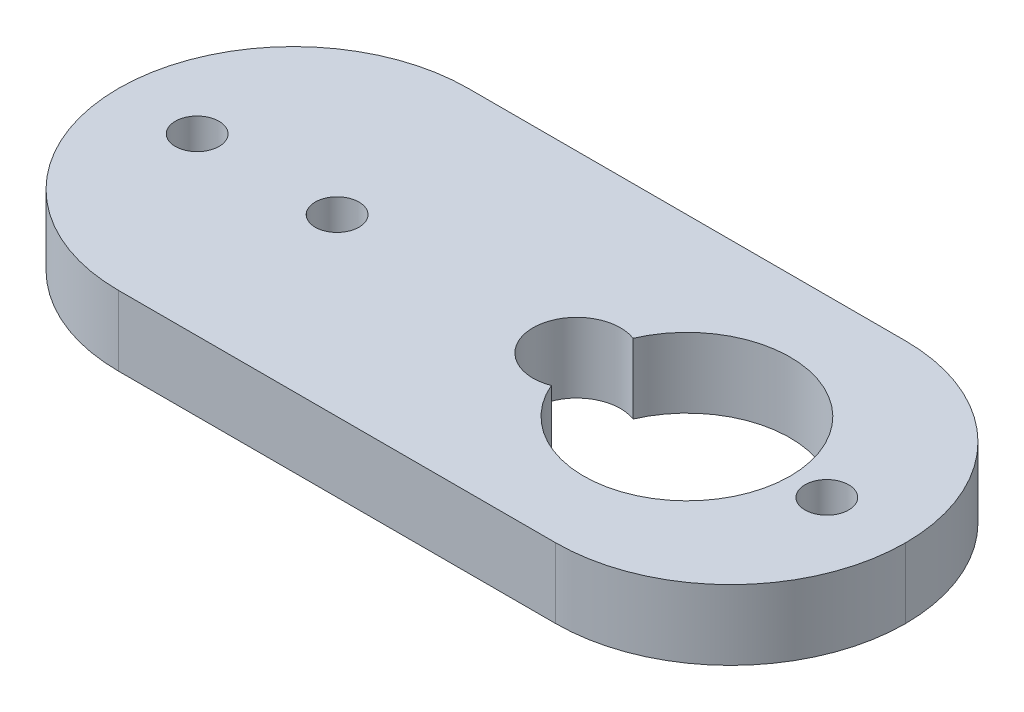
ISO-10303-21;
HEADER;
FILE_DESCRIPTION(('STEP AP214'),'2;1');
FILE_NAME('part.step','',(''),(''),'','','');
FILE_SCHEMA(('AUTOMOTIVE_DESIGN { 1 0 10303 214 1 1 1 1 }'));
ENDSEC;
DATA;
#1=APPLICATION_CONTEXT('core data for automotive mechanical design processes');
#2=APPLICATION_PROTOCOL_DEFINITION('international standard','automotive_design',2000,#1);
#3=PRODUCT_CONTEXT('',#1,'mechanical');
#4=PRODUCT('Part','Part','',(#3));
#5=PRODUCT_RELATED_PRODUCT_CATEGORY('part','',(#4));
#6=PRODUCT_DEFINITION_FORMATION('','',#4);
#7=PRODUCT_DEFINITION_CONTEXT('part definition',#1,'design');
#8=PRODUCT_DEFINITION('design','',#6,#7);
#9=PRODUCT_DEFINITION_SHAPE('','',#8);
#10=(LENGTH_UNIT() NAMED_UNIT(*) SI_UNIT(.MILLI.,.METRE.));
#11=(NAMED_UNIT(*) PLANE_ANGLE_UNIT() SI_UNIT($,.RADIAN.));
#12=(NAMED_UNIT(*) SI_UNIT($,.STERADIAN.) SOLID_ANGLE_UNIT());
#13=UNCERTAINTY_MEASURE_WITH_UNIT(LENGTH_MEASURE(1.E-05),#10,'distance_accuracy_value','');
#14=(GEOMETRIC_REPRESENTATION_CONTEXT(3) GLOBAL_UNCERTAINTY_ASSIGNED_CONTEXT((#13)) GLOBAL_UNIT_ASSIGNED_CONTEXT((#10,
#11,#12)) REPRESENTATION_CONTEXT('',''));
#15=CARTESIAN_POINT('',(0.,0.,0.));
#16=DIRECTION('',(0.,0.,1.));
#17=DIRECTION('',(1.,0.,0.));
#18=AXIS2_PLACEMENT_3D('',#15,#16,#17);
#19=CARTESIAN_POINT('',(22.5,4.,10.));
#20=DIRECTION('',(0.,0.,-1.));
#21=DIRECTION('',(-1.,0.,0.));
#22=AXIS2_PLACEMENT_3D('',#19,#20,#21);
#23=PLANE('',#22);
#24=DIRECTION('',(1.,0.,0.));
#25=VECTOR('',#24,1.);
#26=CARTESIAN_POINT('',(22.5,4.,10.));
#27=LINE('',#26,#25);
#28=CARTESIAN_POINT('',(-12.5,4.,10.));
#29=VERTEX_POINT('',#28);
#30=CARTESIAN_POINT('',(12.5,4.,10.));
#31=VERTEX_POINT('',#30);
#32=EDGE_CURVE('E159',#29,#31,#27,.T.);
#33=ORIENTED_EDGE('',*,*,#32,.F.);
#34=DIRECTION('',(0.,-1.,0.));
#35=VECTOR('',#34,1.);
#36=CARTESIAN_POINT('',(-12.5,4.,10.));
#37=LINE('',#36,#35);
#38=CARTESIAN_POINT('',(-12.5,0.,10.));
#39=VERTEX_POINT('',#38);
#40=EDGE_CURVE('E176',#29,#39,#37,.T.);
#41=ORIENTED_EDGE('',*,*,#40,.T.);
#42=DIRECTION('',(1.,0.,0.));
#43=VECTOR('',#42,1.);
#44=CARTESIAN_POINT('',(22.5,0.,10.));
#45=LINE('',#44,#43);
#46=CARTESIAN_POINT('',(12.5,0.,10.));
#47=VERTEX_POINT('',#46);
#48=EDGE_CURVE('E155',#39,#47,#45,.T.);
#49=ORIENTED_EDGE('',*,*,#48,.T.);
#50=DIRECTION('',(0.,-1.,0.));
#51=VECTOR('',#50,1.);
#52=CARTESIAN_POINT('',(12.5,4.,10.));
#53=LINE('',#52,#51);
#54=EDGE_CURVE('E167',#47,#31,#53,.F.);
#55=ORIENTED_EDGE('',*,*,#54,.T.);
#56=EDGE_LOOP('',(#33,#41,#49,#55));
#57=FACE_BOUND('',#56,.T.);
#58=ADVANCED_FACE('F39',(#57),#23,.F.);
#59=CARTESIAN_POINT('',(22.5,4.,-10.));
#60=DIRECTION('',(0.,0.,1.));
#61=DIRECTION('',(1.,0.,0.));
#62=AXIS2_PLACEMENT_3D('',#59,#60,#61);
#63=PLANE('',#62);
#64=DIRECTION('',(-1.,0.,0.));
#65=VECTOR('',#64,1.);
#66=CARTESIAN_POINT('',(22.5,0.,-10.));
#67=LINE('',#66,#65);
#68=CARTESIAN_POINT('',(12.5,0.,-10.));
#69=VERTEX_POINT('',#68);
#70=CARTESIAN_POINT('',(-12.5,0.,-10.));
#71=VERTEX_POINT('',#70);
#72=EDGE_CURVE('E164',#69,#71,#67,.T.);
#73=ORIENTED_EDGE('',*,*,#72,.T.);
#74=DIRECTION('',(0.,-1.,0.));
#75=VECTOR('',#74,1.);
#76=CARTESIAN_POINT('',(-12.5,4.,-10.));
#77=LINE('',#76,#75);
#78=CARTESIAN_POINT('',(-12.5,4.,-10.));
#79=VERTEX_POINT('',#78);
#80=EDGE_CURVE('E11',#71,#79,#77,.F.);
#81=ORIENTED_EDGE('',*,*,#80,.T.);
#82=DIRECTION('',(-1.,0.,0.));
#83=VECTOR('',#82,1.);
#84=CARTESIAN_POINT('',(22.5,4.,-10.));
#85=LINE('',#84,#83);
#86=CARTESIAN_POINT('',(12.5,4.,-10.));
#87=VERTEX_POINT('',#86);
#88=EDGE_CURVE('E163',#87,#79,#85,.T.);
#89=ORIENTED_EDGE('',*,*,#88,.F.);
#90=DIRECTION('',(0.,-1.,0.));
#91=VECTOR('',#90,1.);
#92=CARTESIAN_POINT('',(12.5,4.,-10.));
#93=LINE('',#92,#91);
#94=EDGE_CURVE('E49',#87,#69,#93,.T.);
#95=ORIENTED_EDGE('',*,*,#94,.T.);
#96=EDGE_LOOP('',(#73,#81,#89,#95));
#97=FACE_BOUND('',#96,.T.);
#98=ADVANCED_FACE('F220',(#97),#63,.F.);
#99=CARTESIAN_POINT('',(0.,4.,0.));
#100=DIRECTION('',(0.,1.,0.));
#101=DIRECTION('',(0.,0.,1.));
#102=AXIS2_PLACEMENT_3D('',#99,#100,#101);
#103=PLANE('',#102);
#104=CARTESIAN_POINT('',(3.7,4.,0.));
#105=DIRECTION('',(0.,1.,0.));
#106=DIRECTION('',(0.,0.,1.));
#107=AXIS2_PLACEMENT_3D('',#104,#105,#106);
#108=CIRCLE('',#107,2.5);
#109=CARTESIAN_POINT('',(4.58333333333333,4.,-2.3387437273507));
#110=VERTEX_POINT('',#109);
#111=CARTESIAN_POINT('',(4.58333333333333,4.,2.3387437273507));
#112=VERTEX_POINT('',#111);
#113=EDGE_CURVE('E112',#110,#112,#108,.T.);
#114=ORIENTED_EDGE('',*,*,#113,.F.);
#115=CARTESIAN_POINT('',(10.,4.,0.));
#116=DIRECTION('',(0.,1.,0.));
#117=DIRECTION('',(0.,0.,1.));
#118=AXIS2_PLACEMENT_3D('',#115,#116,#117);
#119=CIRCLE('',#118,5.9);
#120=EDGE_CURVE('E128',#112,#110,#119,.T.);
#121=ORIENTED_EDGE('',*,*,#120,.F.);
#122=EDGE_LOOP('',(#114,#121));
#123=FACE_BOUND('',#122,.T.);
#124=CARTESIAN_POINT('',(-18.,4.,0.));
#125=DIRECTION('',(0.,1.,0.));
#126=DIRECTION('',(0.,0.,1.));
#127=AXIS2_PLACEMENT_3D('',#124,#125,#126);
#128=CIRCLE('',#127,1.25);
#129=CARTESIAN_POINT('',(-18.,4.,1.25));
#130=VERTEX_POINT('',#129);
#131=EDGE_CURVE('E133',#130,#130,#128,.T.);
#132=ORIENTED_EDGE('',*,*,#131,.F.);
#133=EDGE_LOOP('',(#132));
#134=FACE_BOUND('',#133,.T.);
#135=CARTESIAN_POINT('',(-10.,4.,0.));
#136=DIRECTION('',(0.,1.,0.));
#137=DIRECTION('',(0.,0.,1.));
#138=AXIS2_PLACEMENT_3D('',#135,#136,#137);
#139=CIRCLE('',#138,1.25);
#140=CARTESIAN_POINT('',(-10.,4.,1.25));
#141=VERTEX_POINT('',#140);
#142=EDGE_CURVE('E146',#141,#141,#139,.T.);
#143=ORIENTED_EDGE('',*,*,#142,.F.);
#144=EDGE_LOOP('',(#143));
#145=FACE_BOUND('',#144,.T.);
#146=CARTESIAN_POINT('',(18.,4.,0.));
#147=DIRECTION('',(0.,1.,0.));
#148=DIRECTION('',(0.,0.,1.));
#149=AXIS2_PLACEMENT_3D('',#146,#147,#148);
#150=CIRCLE('',#149,1.25);
#151=CARTESIAN_POINT('',(18.,4.,1.25));
#152=VERTEX_POINT('',#151);
#153=EDGE_CURVE('E145',#152,#152,#150,.T.);
#154=ORIENTED_EDGE('',*,*,#153,.F.);
#155=EDGE_LOOP('',(#154));
#156=FACE_BOUND('',#155,.T.);
#157=CARTESIAN_POINT('',(-12.5,4.,0.));
#158=DIRECTION('',(0.,1.,0.));
#159=DIRECTION('',(0.,0.,1.));
#160=AXIS2_PLACEMENT_3D('',#157,#158,#159);
#161=CIRCLE('',#160,10.);
#162=CARTESIAN_POINT('',(-22.5,4.,0.));
#163=VERTEX_POINT('',#162);
#164=EDGE_CURVE('E197',#79,#163,#161,.T.);
#165=ORIENTED_EDGE('',*,*,#164,.T.);
#166=CARTESIAN_POINT('',(-12.5,4.,0.));
#167=DIRECTION('',(0.,1.,0.));
#168=DIRECTION('',(0.,0.,1.));
#169=AXIS2_PLACEMENT_3D('',#166,#167,#168);
#170=CIRCLE('',#169,10.);
#171=EDGE_CURVE('E200',#163,#29,#170,.T.);
#172=ORIENTED_EDGE('',*,*,#171,.T.);
#173=ORIENTED_EDGE('',*,*,#32,.T.);
#174=CARTESIAN_POINT('',(12.5,4.,0.));
#175=DIRECTION('',(0.,1.,0.));
#176=DIRECTION('',(0.,0.,1.));
#177=AXIS2_PLACEMENT_3D('',#174,#175,#176);
#178=CIRCLE('',#177,10.);
#179=CARTESIAN_POINT('',(22.5,4.,0.));
#180=VERTEX_POINT('',#179);
#181=EDGE_CURVE('E194',#31,#180,#178,.T.);
#182=ORIENTED_EDGE('',*,*,#181,.T.);
#183=CARTESIAN_POINT('',(12.5,4.,0.));
#184=DIRECTION('',(0.,1.,0.));
#185=DIRECTION('',(0.,0.,1.));
#186=AXIS2_PLACEMENT_3D('',#183,#184,#185);
#187=CIRCLE('',#186,10.);
#188=EDGE_CURVE('E62',#180,#87,#187,.T.);
#189=ORIENTED_EDGE('',*,*,#188,.T.);
#190=ORIENTED_EDGE('',*,*,#88,.T.);
#191=EDGE_LOOP('',(#165,#172,#173,#182,#189,#190));
#192=FACE_BOUND('',#191,.T.);
#193=ADVANCED_FACE('F227',(#123,#134,#145,#156,#192),#103,.T.);
#194=CARTESIAN_POINT('',(0.,0.,0.));
#195=DIRECTION('',(0.,1.,0.));
#196=DIRECTION('',(0.,0.,1.));
#197=AXIS2_PLACEMENT_3D('',#194,#195,#196);
#198=PLANE('',#197);
#199=CARTESIAN_POINT('',(10.,0.,0.));
#200=DIRECTION('',(0.,1.,0.));
#201=DIRECTION('',(0.,0.,1.));
#202=AXIS2_PLACEMENT_3D('',#199,#200,#201);
#203=CIRCLE('',#202,5.9);
#204=CARTESIAN_POINT('',(4.58333333333333,0.,2.3387437273507));
#205=VERTEX_POINT('',#204);
#206=CARTESIAN_POINT('',(4.58333333333333,0.,-2.3387437273507));
#207=VERTEX_POINT('',#206);
#208=EDGE_CURVE('E118',#205,#207,#203,.T.);
#209=ORIENTED_EDGE('',*,*,#208,.T.);
#210=CARTESIAN_POINT('',(3.7,0.,0.));
#211=DIRECTION('',(0.,1.,0.));
#212=DIRECTION('',(0.,0.,1.));
#213=AXIS2_PLACEMENT_3D('',#210,#211,#212);
#214=CIRCLE('',#213,2.5);
#215=EDGE_CURVE('E109',#207,#205,#214,.T.);
#216=ORIENTED_EDGE('',*,*,#215,.T.);
#217=EDGE_LOOP('',(#209,#216));
#218=FACE_BOUND('',#217,.T.);
#219=CARTESIAN_POINT('',(-18.,0.,0.));
#220=DIRECTION('',(0.,1.,0.));
#221=DIRECTION('',(0.,0.,1.));
#222=AXIS2_PLACEMENT_3D('',#219,#220,#221);
#223=CIRCLE('',#222,1.25);
#224=CARTESIAN_POINT('',(-18.,0.,1.25));
#225=VERTEX_POINT('',#224);
#226=EDGE_CURVE('E150',#225,#225,#223,.T.);
#227=ORIENTED_EDGE('',*,*,#226,.T.);
#228=EDGE_LOOP('',(#227));
#229=FACE_BOUND('',#228,.T.);
#230=CARTESIAN_POINT('',(-10.,0.,0.));
#231=DIRECTION('',(0.,1.,0.));
#232=DIRECTION('',(0.,0.,1.));
#233=AXIS2_PLACEMENT_3D('',#230,#231,#232);
#234=CIRCLE('',#233,1.25);
#235=CARTESIAN_POINT('',(-10.,0.,1.25));
#236=VERTEX_POINT('',#235);
#237=EDGE_CURVE('E141',#236,#236,#234,.T.);
#238=ORIENTED_EDGE('',*,*,#237,.T.);
#239=EDGE_LOOP('',(#238));
#240=FACE_BOUND('',#239,.T.);
#241=CARTESIAN_POINT('',(18.,0.,0.));
#242=DIRECTION('',(0.,1.,0.));
#243=DIRECTION('',(0.,0.,1.));
#244=AXIS2_PLACEMENT_3D('',#241,#242,#243);
#245=CIRCLE('',#244,1.25);
#246=CARTESIAN_POINT('',(18.,0.,1.25));
#247=VERTEX_POINT('',#246);
#248=EDGE_CURVE('E151',#247,#247,#245,.T.);
#249=ORIENTED_EDGE('',*,*,#248,.T.);
#250=EDGE_LOOP('',(#249));
#251=FACE_BOUND('',#250,.T.);
#252=ORIENTED_EDGE('',*,*,#48,.F.);
#253=CARTESIAN_POINT('',(-12.5,0.,0.));
#254=DIRECTION('',(0.,1.,0.));
#255=DIRECTION('',(0.,0.,1.));
#256=AXIS2_PLACEMENT_3D('',#253,#254,#255);
#257=CIRCLE('',#256,10.);
#258=CARTESIAN_POINT('',(-22.5,0.,0.));
#259=VERTEX_POINT('',#258);
#260=EDGE_CURVE('E189',#39,#259,#257,.F.);
#261=ORIENTED_EDGE('',*,*,#260,.T.);
#262=CARTESIAN_POINT('',(-12.5,0.,0.));
#263=DIRECTION('',(0.,1.,0.));
#264=DIRECTION('',(0.,0.,1.));
#265=AXIS2_PLACEMENT_3D('',#262,#263,#264);
#266=CIRCLE('',#265,10.);
#267=EDGE_CURVE('E186',#259,#71,#266,.F.);
#268=ORIENTED_EDGE('',*,*,#267,.T.);
#269=ORIENTED_EDGE('',*,*,#72,.F.);
#270=CARTESIAN_POINT('',(12.5,0.,0.));
#271=DIRECTION('',(0.,1.,0.));
#272=DIRECTION('',(0.,0.,1.));
#273=AXIS2_PLACEMENT_3D('',#270,#271,#272);
#274=CIRCLE('',#273,10.);
#275=CARTESIAN_POINT('',(22.5,0.,0.));
#276=VERTEX_POINT('',#275);
#277=EDGE_CURVE('E180',#69,#276,#274,.F.);
#278=ORIENTED_EDGE('',*,*,#277,.T.);
#279=CARTESIAN_POINT('',(12.5,0.,0.));
#280=DIRECTION('',(0.,1.,0.));
#281=DIRECTION('',(0.,0.,1.));
#282=AXIS2_PLACEMENT_3D('',#279,#280,#281);
#283=CIRCLE('',#282,10.);
#284=EDGE_CURVE('E183',#276,#47,#283,.F.);
#285=ORIENTED_EDGE('',*,*,#284,.T.);
#286=EDGE_LOOP('',(#252,#261,#268,#269,#278,#285));
#287=FACE_BOUND('',#286,.T.);
#288=ADVANCED_FACE('F125',(#218,#229,#240,#251,#287),#198,.F.);
#289=CARTESIAN_POINT('',(18.,0.,0.));
#290=DIRECTION('',(0.,1.,0.));
#291=DIRECTION('',(0.,0.,1.));
#292=AXIS2_PLACEMENT_3D('',#289,#290,#291);
#293=CYLINDRICAL_SURFACE('',#292,1.25);
#294=ORIENTED_EDGE('',*,*,#248,.F.);
#295=EDGE_LOOP('',(#294));
#296=FACE_BOUND('',#295,.T.);
#297=ORIENTED_EDGE('',*,*,#153,.T.);
#298=EDGE_LOOP('',(#297));
#299=FACE_BOUND('',#298,.T.);
#300=ADVANCED_FACE('F248',(#296,#299),#293,.F.);
#301=CARTESIAN_POINT('',(-10.,0.,0.));
#302=DIRECTION('',(0.,1.,0.));
#303=DIRECTION('',(0.,0.,1.));
#304=AXIS2_PLACEMENT_3D('',#301,#302,#303);
#305=CYLINDRICAL_SURFACE('',#304,1.25);
#306=ORIENTED_EDGE('',*,*,#237,.F.);
#307=EDGE_LOOP('',(#306));
#308=FACE_BOUND('',#307,.T.);
#309=ORIENTED_EDGE('',*,*,#142,.T.);
#310=EDGE_LOOP('',(#309));
#311=FACE_BOUND('',#310,.T.);
#312=ADVANCED_FACE('F254',(#308,#311),#305,.F.);
#313=CARTESIAN_POINT('',(-18.,0.,0.));
#314=DIRECTION('',(0.,1.,0.));
#315=DIRECTION('',(0.,0.,1.));
#316=AXIS2_PLACEMENT_3D('',#313,#314,#315);
#317=CYLINDRICAL_SURFACE('',#316,1.25);
#318=ORIENTED_EDGE('',*,*,#226,.F.);
#319=EDGE_LOOP('',(#318));
#320=FACE_BOUND('',#319,.T.);
#321=ORIENTED_EDGE('',*,*,#131,.T.);
#322=EDGE_LOOP('',(#321));
#323=FACE_BOUND('',#322,.T.);
#324=ADVANCED_FACE('F258',(#320,#323),#317,.F.);
#325=CARTESIAN_POINT('',(3.7,0.,0.));
#326=DIRECTION('',(0.,1.,0.));
#327=DIRECTION('',(0.,0.,1.));
#328=AXIS2_PLACEMENT_3D('',#325,#326,#327);
#329=CYLINDRICAL_SURFACE('',#328,2.5);
#330=ORIENTED_EDGE('',*,*,#113,.T.);
#331=DIRECTION('',(0.,1.,0.));
#332=VECTOR('',#331,1.);
#333=CARTESIAN_POINT('',(4.58333333333333,0.,2.3387437273507));
#334=LINE('',#333,#332);
#335=EDGE_CURVE('E105',#205,#112,#334,.T.);
#336=ORIENTED_EDGE('',*,*,#335,.F.);
#337=ORIENTED_EDGE('',*,*,#215,.F.);
#338=DIRECTION('',(0.,1.,0.));
#339=VECTOR('',#338,1.);
#340=CARTESIAN_POINT('',(4.58333333333333,0.,-2.3387437273507));
#341=LINE('',#340,#339);
#342=EDGE_CURVE('E117',#207,#110,#341,.T.);
#343=ORIENTED_EDGE('',*,*,#342,.T.);
#344=EDGE_LOOP('',(#330,#336,#337,#343));
#345=FACE_BOUND('',#344,.T.);
#346=ADVANCED_FACE('F107',(#345),#329,.F.);
#347=CARTESIAN_POINT('',(10.,0.,0.));
#348=DIRECTION('',(0.,1.,0.));
#349=DIRECTION('',(0.,0.,1.));
#350=AXIS2_PLACEMENT_3D('',#347,#348,#349);
#351=CYLINDRICAL_SURFACE('',#350,5.9);
#352=ORIENTED_EDGE('',*,*,#120,.T.);
#353=ORIENTED_EDGE('',*,*,#342,.F.);
#354=ORIENTED_EDGE('',*,*,#208,.F.);
#355=ORIENTED_EDGE('',*,*,#335,.T.);
#356=EDGE_LOOP('',(#352,#353,#354,#355));
#357=FACE_BOUND('',#356,.T.);
#358=ADVANCED_FACE('F121',(#357),#351,.F.);
#359=CARTESIAN_POINT('',(-12.5,4.,0.));
#360=DIRECTION('',(0.,-1.,0.));
#361=DIRECTION('',(0.,0.,-1.));
#362=AXIS2_PLACEMENT_3D('',#359,#360,#361);
#363=CYLINDRICAL_SURFACE('',#362,10.);
#364=DIRECTION('',(0.,-1.,0.));
#365=VECTOR('',#364,1.);
#366=CARTESIAN_POINT('',(-22.5,4.,0.));
#367=LINE('',#366,#365);
#368=EDGE_CURVE('E137',#163,#259,#367,.T.);
#369=ORIENTED_EDGE('',*,*,#368,.F.);
#370=ORIENTED_EDGE('',*,*,#164,.F.);
#371=ORIENTED_EDGE('',*,*,#80,.F.);
#372=ORIENTED_EDGE('',*,*,#267,.F.);
#373=EDGE_LOOP('',(#369,#370,#371,#372));
#374=FACE_BOUND('',#373,.T.);
#375=ADVANCED_FACE('F225',(#374),#363,.T.);
#376=CARTESIAN_POINT('',(-12.5,4.,0.));
#377=DIRECTION('',(0.,-1.,0.));
#378=DIRECTION('',(0.,0.,-1.));
#379=AXIS2_PLACEMENT_3D('',#376,#377,#378);
#380=CYLINDRICAL_SURFACE('',#379,10.);
#381=ORIENTED_EDGE('',*,*,#171,.F.);
#382=ORIENTED_EDGE('',*,*,#368,.T.);
#383=ORIENTED_EDGE('',*,*,#260,.F.);
#384=ORIENTED_EDGE('',*,*,#40,.F.);
#385=EDGE_LOOP('',(#381,#382,#383,#384));
#386=FACE_BOUND('',#385,.T.);
#387=ADVANCED_FACE('F231',(#386),#380,.T.);
#388=CARTESIAN_POINT('',(12.5,4.,0.));
#389=DIRECTION('',(0.,-1.,0.));
#390=DIRECTION('',(0.,0.,-1.));
#391=AXIS2_PLACEMENT_3D('',#388,#389,#390);
#392=CYLINDRICAL_SURFACE('',#391,10.);
#393=ORIENTED_EDGE('',*,*,#94,.F.);
#394=ORIENTED_EDGE('',*,*,#188,.F.);
#395=DIRECTION('',(0.,-1.,0.));
#396=VECTOR('',#395,1.);
#397=CARTESIAN_POINT('',(22.5,4.,0.));
#398=LINE('',#397,#396);
#399=EDGE_CURVE('E43',#276,#180,#398,.F.);
#400=ORIENTED_EDGE('',*,*,#399,.F.);
#401=ORIENTED_EDGE('',*,*,#277,.F.);
#402=EDGE_LOOP('',(#393,#394,#400,#401));
#403=FACE_BOUND('',#402,.T.);
#404=ADVANCED_FACE('F41',(#403),#392,.T.);
#405=CARTESIAN_POINT('',(12.5,4.,0.));
#406=DIRECTION('',(0.,-1.,0.));
#407=DIRECTION('',(0.,0.,-1.));
#408=AXIS2_PLACEMENT_3D('',#405,#406,#407);
#409=CYLINDRICAL_SURFACE('',#408,10.);
#410=ORIENTED_EDGE('',*,*,#181,.F.);
#411=ORIENTED_EDGE('',*,*,#54,.F.);
#412=ORIENTED_EDGE('',*,*,#284,.F.);
#413=ORIENTED_EDGE('',*,*,#399,.T.);
#414=EDGE_LOOP('',(#410,#411,#412,#413));
#415=FACE_BOUND('',#414,.T.);
#416=ADVANCED_FACE('F214',(#415),#409,.T.);
#417=CLOSED_SHELL('',(#58,#98,#193,#288,#300,#312,#324,#346,#358,#375,#387,#404,#416));
#418=MANIFOLD_SOLID_BREP('B2',#417);
#419=ADVANCED_BREP_SHAPE_REPRESENTATION('',(#18,#418),#14);
#420=SHAPE_DEFINITION_REPRESENTATION(#9,#419);
ENDSEC;
END-ISO-10303-21;
